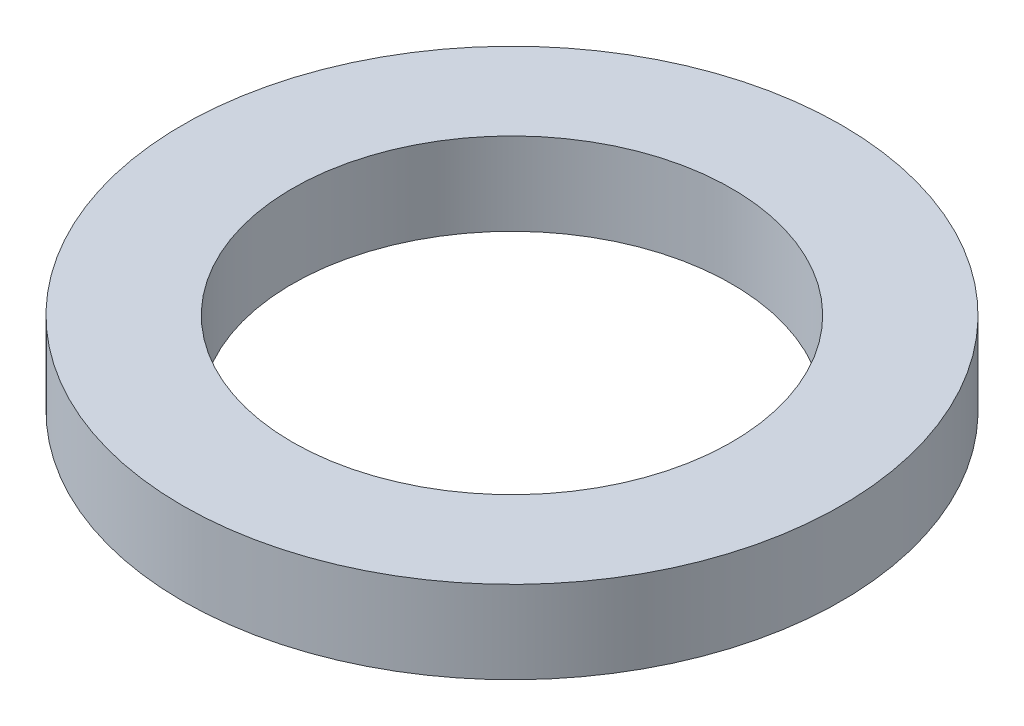
ISO-10303-21;
HEADER;
FILE_DESCRIPTION(('STEP AP214'),'2;1');
FILE_NAME('part.step','',(''),(''),'','','');
FILE_SCHEMA(('AUTOMOTIVE_DESIGN { 1 0 10303 214 1 1 1 1 }'));
ENDSEC;
DATA;
#1=APPLICATION_CONTEXT('core data for automotive mechanical design processes');
#2=APPLICATION_PROTOCOL_DEFINITION('international standard','automotive_design',2000,#1);
#3=PRODUCT_CONTEXT('',#1,'mechanical');
#4=PRODUCT('Part','Part','',(#3));
#5=PRODUCT_RELATED_PRODUCT_CATEGORY('part','',(#4));
#6=PRODUCT_DEFINITION_FORMATION('','',#4);
#7=PRODUCT_DEFINITION_CONTEXT('part definition',#1,'design');
#8=PRODUCT_DEFINITION('design','',#6,#7);
#9=PRODUCT_DEFINITION_SHAPE('','',#8);
#10=(LENGTH_UNIT() NAMED_UNIT(*) SI_UNIT(.MILLI.,.METRE.));
#11=(NAMED_UNIT(*) PLANE_ANGLE_UNIT() SI_UNIT($,.RADIAN.));
#12=(NAMED_UNIT(*) SI_UNIT($,.STERADIAN.) SOLID_ANGLE_UNIT());
#13=UNCERTAINTY_MEASURE_WITH_UNIT(LENGTH_MEASURE(1.E-05),#10,'distance_accuracy_value','');
#14=(GEOMETRIC_REPRESENTATION_CONTEXT(3) GLOBAL_UNCERTAINTY_ASSIGNED_CONTEXT((#13)) GLOBAL_UNIT_ASSIGNED_CONTEXT((#10,
#11,#12)) REPRESENTATION_CONTEXT('',''));
#15=CARTESIAN_POINT('',(0.,0.,0.));
#16=DIRECTION('',(0.,0.,1.));
#17=DIRECTION('',(1.,0.,0.));
#18=AXIS2_PLACEMENT_3D('',#15,#16,#17);
#19=CARTESIAN_POINT('',(0.,1.1938,0.));
#20=DIRECTION('',(0.,-1.,0.));
#21=DIRECTION('',(0.,0.,-1.));
#22=AXIS2_PLACEMENT_3D('',#19,#20,#21);
#23=CYLINDRICAL_SURFACE('',#22,4.7625);
#24=CARTESIAN_POINT('',(0.,1.1938,0.));
#25=DIRECTION('',(0.,1.,0.));
#26=DIRECTION('',(0.,0.,1.));
#27=AXIS2_PLACEMENT_3D('',#24,#25,#26);
#28=CIRCLE('',#27,4.7625);
#29=CARTESIAN_POINT('',(0.,1.1938,4.7625));
#30=VERTEX_POINT('',#29);
#31=EDGE_CURVE('E10',#30,#30,#28,.T.);
#32=ORIENTED_EDGE('',*,*,#31,.F.);
#33=EDGE_LOOP('',(#32));
#34=FACE_BOUND('',#33,.T.);
#35=CARTESIAN_POINT('',(0.,0.,0.));
#36=DIRECTION('',(0.,1.,0.));
#37=DIRECTION('',(0.,0.,1.));
#38=AXIS2_PLACEMENT_3D('',#35,#36,#37);
#39=CIRCLE('',#38,4.7625);
#40=CARTESIAN_POINT('',(0.,0.,4.7625));
#41=VERTEX_POINT('',#40);
#42=EDGE_CURVE('E33',#41,#41,#39,.T.);
#43=ORIENTED_EDGE('',*,*,#42,.T.);
#44=EDGE_LOOP('',(#43));
#45=FACE_BOUND('',#44,.T.);
#46=ADVANCED_FACE('F30',(#34,#45),#23,.T.);
#47=CARTESIAN_POINT('',(0.,1.1938,0.));
#48=DIRECTION('',(0.,1.,0.));
#49=DIRECTION('',(0.,0.,1.));
#50=AXIS2_PLACEMENT_3D('',#47,#48,#49);
#51=PLANE('',#50);
#52=CARTESIAN_POINT('',(0.,1.1938,0.));
#53=DIRECTION('',(0.,1.,0.));
#54=DIRECTION('',(0.,0.,1.));
#55=AXIS2_PLACEMENT_3D('',#52,#53,#54);
#56=CIRCLE('',#55,3.175);
#57=CARTESIAN_POINT('',(0.,1.1938,3.175));
#58=VERTEX_POINT('',#57);
#59=EDGE_CURVE('E42',#58,#58,#56,.T.);
#60=ORIENTED_EDGE('',*,*,#59,.F.);
#61=EDGE_LOOP('',(#60));
#62=FACE_BOUND('',#61,.T.);
#63=ORIENTED_EDGE('',*,*,#31,.T.);
#64=EDGE_LOOP('',(#63));
#65=FACE_BOUND('',#64,.T.);
#66=ADVANCED_FACE('F57',(#62,#65),#51,.T.);
#67=CARTESIAN_POINT('',(0.,0.,0.));
#68=DIRECTION('',(0.,1.,0.));
#69=DIRECTION('',(0.,0.,1.));
#70=AXIS2_PLACEMENT_3D('',#67,#68,#69);
#71=PLANE('',#70);
#72=CARTESIAN_POINT('',(0.,0.,0.));
#73=DIRECTION('',(0.,1.,0.));
#74=DIRECTION('',(0.,0.,1.));
#75=AXIS2_PLACEMENT_3D('',#72,#73,#74);
#76=CIRCLE('',#75,3.175);
#77=CARTESIAN_POINT('',(0.,0.,3.175));
#78=VERTEX_POINT('',#77);
#79=EDGE_CURVE('E40',#78,#78,#76,.T.);
#80=ORIENTED_EDGE('',*,*,#79,.T.);
#81=EDGE_LOOP('',(#80));
#82=FACE_BOUND('',#81,.T.);
#83=ORIENTED_EDGE('',*,*,#42,.F.);
#84=EDGE_LOOP('',(#83));
#85=FACE_BOUND('',#84,.T.);
#86=ADVANCED_FACE('F48',(#82,#85),#71,.F.);
#87=CARTESIAN_POINT('',(0.,0.,0.));
#88=DIRECTION('',(0.,1.,0.));
#89=DIRECTION('',(0.,0.,1.));
#90=AXIS2_PLACEMENT_3D('',#87,#88,#89);
#91=CYLINDRICAL_SURFACE('',#90,3.175);
#92=ORIENTED_EDGE('',*,*,#79,.F.);
#93=EDGE_LOOP('',(#92));
#94=FACE_BOUND('',#93,.T.);
#95=ORIENTED_EDGE('',*,*,#59,.T.);
#96=EDGE_LOOP('',(#95));
#97=FACE_BOUND('',#96,.T.);
#98=ADVANCED_FACE('F51',(#94,#97),#91,.F.);
#99=CLOSED_SHELL('',(#46,#66,#86,#98));
#100=MANIFOLD_SOLID_BREP('B2',#99);
#101=ADVANCED_BREP_SHAPE_REPRESENTATION('',(#18,#100),#14);
#102=SHAPE_DEFINITION_REPRESENTATION(#9,#101);
ENDSEC;
END-ISO-10303-21;
